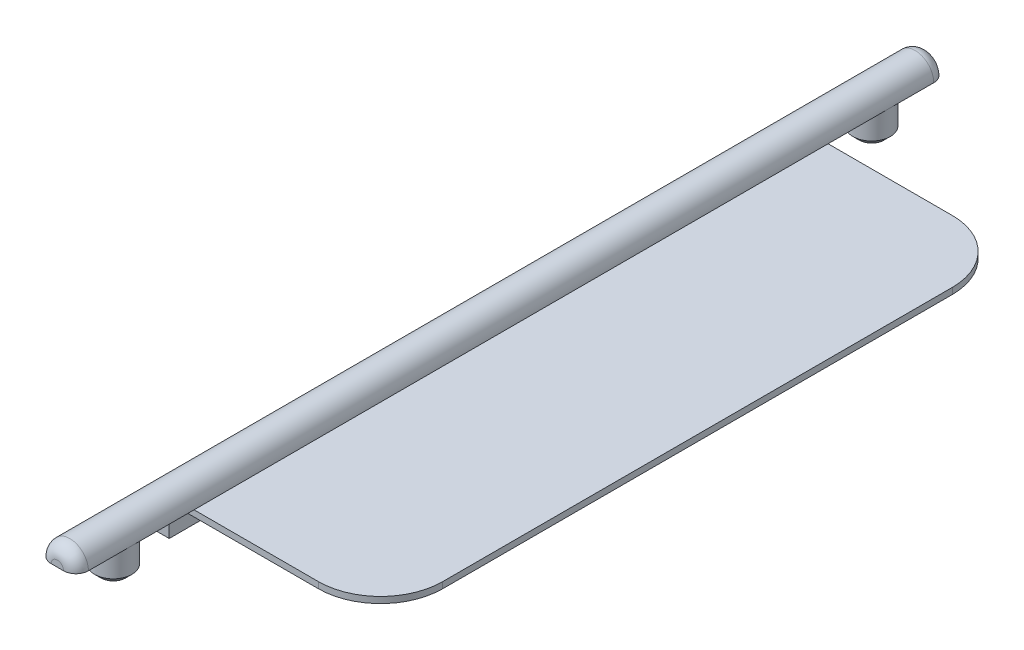
ISO-10303-21;
HEADER;
FILE_DESCRIPTION(('STEP AP214'),'2;1');
FILE_NAME('part.step','',(''),(''),'','','');
FILE_SCHEMA(('AUTOMOTIVE_DESIGN { 1 0 10303 214 1 1 1 1 }'));
ENDSEC;
DATA;
#1=APPLICATION_CONTEXT('core data for automotive mechanical design processes');
#2=APPLICATION_PROTOCOL_DEFINITION('international standard','automotive_design',2000,#1);
#3=PRODUCT_CONTEXT('',#1,'mechanical');
#4=PRODUCT('Part','Part','',(#3));
#5=PRODUCT_RELATED_PRODUCT_CATEGORY('part','',(#4));
#6=PRODUCT_DEFINITION_FORMATION('','',#4);
#7=PRODUCT_DEFINITION_CONTEXT('part definition',#1,'design');
#8=PRODUCT_DEFINITION('design','',#6,#7);
#9=PRODUCT_DEFINITION_SHAPE('','',#8);
#10=(LENGTH_UNIT() NAMED_UNIT(*) SI_UNIT(.MILLI.,.METRE.));
#11=(NAMED_UNIT(*) PLANE_ANGLE_UNIT() SI_UNIT($,.RADIAN.));
#12=(NAMED_UNIT(*) SI_UNIT($,.STERADIAN.) SOLID_ANGLE_UNIT());
#13=UNCERTAINTY_MEASURE_WITH_UNIT(LENGTH_MEASURE(1.E-05),#10,'distance_accuracy_value','');
#14=(GEOMETRIC_REPRESENTATION_CONTEXT(3) GLOBAL_UNCERTAINTY_ASSIGNED_CONTEXT((#13)) GLOBAL_UNIT_ASSIGNED_CONTEXT((#10,
#11,#12)) REPRESENTATION_CONTEXT('',''));
#15=CARTESIAN_POINT('',(0.,0.,0.));
#16=DIRECTION('',(0.,0.,1.));
#17=DIRECTION('',(1.,0.,0.));
#18=AXIS2_PLACEMENT_3D('',#15,#16,#17);
#19=CARTESIAN_POINT('',(-3.,0.,140.));
#20=DIRECTION('',(0.,1.,0.));
#21=DIRECTION('',(0.,0.,1.));
#22=AXIS2_PLACEMENT_3D('',#19,#20,#21);
#23=PLANE('',#22);
#24=DIRECTION('',(0.,0.,1.));
#25=VECTOR('',#24,1.);
#26=CARTESIAN_POINT('',(-1.,0.,19.));
#27=LINE('',#26,#25);
#28=CARTESIAN_POINT('',(-0.999999999999997,0.,19.));
#29=VERTEX_POINT('',#28);
#30=CARTESIAN_POINT('',(-1.,0.,121.));
#31=VERTEX_POINT('',#30);
#32=EDGE_CURVE('E50',#29,#31,#27,.T.);
#33=ORIENTED_EDGE('',*,*,#32,.F.);
#34=DIRECTION('',(-1.,0.,0.));
#35=VECTOR('',#34,1.);
#36=CARTESIAN_POINT('',(3.,0.,19.));
#37=LINE('',#36,#35);
#38=CARTESIAN_POINT('',(23.,0.,19.));
#39=VERTEX_POINT('',#38);
#40=EDGE_CURVE('E206',#39,#29,#37,.T.);
#41=ORIENTED_EDGE('',*,*,#40,.F.);
#42=CARTESIAN_POINT('',(23.,0.,29.));
#43=DIRECTION('',(0.,1.,0.));
#44=DIRECTION('',(0.,0.,1.));
#45=AXIS2_PLACEMENT_3D('',#42,#43,#44);
#46=CIRCLE('',#45,10.);
#47=CARTESIAN_POINT('',(33.,0.,29.));
#48=VERTEX_POINT('',#47);
#49=EDGE_CURVE('E42',#39,#48,#46,.F.);
#50=ORIENTED_EDGE('',*,*,#49,.T.);
#51=DIRECTION('',(0.,0.,-1.));
#52=VECTOR('',#51,1.);
#53=CARTESIAN_POINT('',(33.,0.,121.));
#54=LINE('',#53,#52);
#55=CARTESIAN_POINT('',(33.,0.,111.));
#56=VERTEX_POINT('',#55);
#57=EDGE_CURVE('E177',#56,#48,#54,.T.);
#58=ORIENTED_EDGE('',*,*,#57,.F.);
#59=CARTESIAN_POINT('',(23.,0.,111.));
#60=DIRECTION('',(0.,1.,0.));
#61=DIRECTION('',(0.,0.,1.));
#62=AXIS2_PLACEMENT_3D('',#59,#60,#61);
#63=CIRCLE('',#62,10.);
#64=CARTESIAN_POINT('',(23.,0.,121.));
#65=VERTEX_POINT('',#64);
#66=EDGE_CURVE('E222',#56,#65,#63,.F.);
#67=ORIENTED_EDGE('',*,*,#66,.T.);
#68=DIRECTION('',(1.,0.,0.));
#69=VECTOR('',#68,1.);
#70=CARTESIAN_POINT('',(-3.,0.,121.));
#71=LINE('',#70,#69);
#72=EDGE_CURVE('E56',#31,#65,#71,.T.);
#73=ORIENTED_EDGE('',*,*,#72,.F.);
#74=EDGE_LOOP('',(#33,#41,#50,#58,#67,#73));
#75=FACE_BOUND('',#74,.T.);
#76=ADVANCED_FACE('F33',(#75),#23,.F.);
#77=CARTESIAN_POINT('',(0.,1.,0.));
#78=DIRECTION('',(0.,-1.,0.));
#79=DIRECTION('',(0.,0.,-1.));
#80=AXIS2_PLACEMENT_3D('',#77,#78,#79);
#81=PLANE('',#80);
#82=DIRECTION('',(0.,0.,-1.));
#83=VECTOR('',#82,1.);
#84=CARTESIAN_POINT('',(-3.,1.,0.));
#85=LINE('',#84,#83);
#86=CARTESIAN_POINT('',(-3.,1.,19.));
#87=VERTEX_POINT('',#86);
#88=CARTESIAN_POINT('',(-3.,1.,9.00000000000001));
#89=VERTEX_POINT('',#88);
#90=EDGE_CURVE('E207',#87,#89,#85,.T.);
#91=ORIENTED_EDGE('',*,*,#90,.T.);
#92=CARTESIAN_POINT('',(0.,1.,9.00000000000001));
#93=DIRECTION('',(0.,-1.,0.));
#94=DIRECTION('',(0.,0.,-1.));
#95=AXIS2_PLACEMENT_3D('',#92,#93,#94);
#96=CIRCLE('',#95,3.);
#97=CARTESIAN_POINT('',(3.,1.,9.00000000000001));
#98=VERTEX_POINT('',#97);
#99=EDGE_CURVE('E201',#98,#89,#96,.T.);
#100=ORIENTED_EDGE('',*,*,#99,.F.);
#101=DIRECTION('',(0.,0.,1.));
#102=VECTOR('',#101,1.);
#103=CARTESIAN_POINT('',(3.,1.,0.));
#104=LINE('',#103,#102);
#105=CARTESIAN_POINT('',(3.,1.,19.));
#106=VERTEX_POINT('',#105);
#107=EDGE_CURVE('E214',#98,#106,#104,.T.);
#108=ORIENTED_EDGE('',*,*,#107,.T.);
#109=DIRECTION('',(-1.,0.,0.));
#110=VECTOR('',#109,1.);
#111=CARTESIAN_POINT('',(3.,1.,19.));
#112=LINE('',#111,#110);
#113=EDGE_CURVE('E153',#106,#87,#112,.T.);
#114=ORIENTED_EDGE('',*,*,#113,.T.);
#115=EDGE_LOOP('',(#91,#100,#108,#114));
#116=FACE_BOUND('',#115,.T.);
#117=ADVANCED_FACE('F319',(#116),#81,.T.);
#118=CARTESIAN_POINT('',(-3.,1.,2.));
#119=VERTEX_POINT('',#118);
#120=EDGE_CURVE('E211',#89,#119,#85,.T.);
#121=ORIENTED_EDGE('',*,*,#120,.T.);
#122=CARTESIAN_POINT('',(-1.,1.,2.));
#123=DIRECTION('',(0.,-1.,0.));
#124=DIRECTION('',(0.,0.,-1.));
#125=AXIS2_PLACEMENT_3D('',#122,#123,#124);
#126=CIRCLE('',#125,2.);
#127=CARTESIAN_POINT('',(-1.,1.,0.));
#128=VERTEX_POINT('',#127);
#129=EDGE_CURVE('E236',#119,#128,#126,.T.);
#130=ORIENTED_EDGE('',*,*,#129,.T.);
#131=DIRECTION('',(1.,0.,0.));
#132=VECTOR('',#131,1.);
#133=CARTESIAN_POINT('',(3.,1.,0.));
#134=LINE('',#133,#132);
#135=CARTESIAN_POINT('',(1.,1.,0.));
#136=VERTEX_POINT('',#135);
#137=EDGE_CURVE('E210',#128,#136,#134,.T.);
#138=ORIENTED_EDGE('',*,*,#137,.T.);
#139=CARTESIAN_POINT('',(1.,1.,2.));
#140=DIRECTION('',(0.,-1.,0.));
#141=DIRECTION('',(0.,0.,-1.));
#142=AXIS2_PLACEMENT_3D('',#139,#140,#141);
#143=CIRCLE('',#142,2.);
#144=CARTESIAN_POINT('',(3.,1.,2.));
#145=VERTEX_POINT('',#144);
#146=EDGE_CURVE('E238',#136,#145,#143,.T.);
#147=ORIENTED_EDGE('',*,*,#146,.T.);
#148=EDGE_CURVE('E215',#145,#98,#104,.T.);
#149=ORIENTED_EDGE('',*,*,#148,.T.);
#150=CARTESIAN_POINT('',(0.,1.,9.00000000000001));
#151=DIRECTION('',(0.,-1.,0.));
#152=DIRECTION('',(0.,0.,-1.));
#153=AXIS2_PLACEMENT_3D('',#150,#151,#152);
#154=CIRCLE('',#153,3.);
#155=EDGE_CURVE('E264',#98,#89,#154,.F.);
#156=ORIENTED_EDGE('',*,*,#155,.T.);
#157=EDGE_LOOP('',(#121,#130,#138,#147,#149,#156));
#158=FACE_BOUND('',#157,.T.);
#159=ADVANCED_FACE('F327',(#158),#81,.T.);
#160=CARTESIAN_POINT('',(0.,1.,0.));
#161=DIRECTION('',(0.,-1.,0.));
#162=DIRECTION('',(0.,0.,-1.));
#163=AXIS2_PLACEMENT_3D('',#160,#161,#162);
#164=PLANE('',#163);
#165=DIRECTION('',(-1.,0.,0.));
#166=VECTOR('',#165,1.);
#167=CARTESIAN_POINT('',(-3.,1.,140.));
#168=LINE('',#167,#166);
#169=CARTESIAN_POINT('',(0.999999999999999,1.,140.));
#170=VERTEX_POINT('',#169);
#171=CARTESIAN_POINT('',(-1.,1.,140.));
#172=VERTEX_POINT('',#171);
#173=EDGE_CURVE('E282',#170,#172,#168,.T.);
#174=ORIENTED_EDGE('',*,*,#173,.T.);
#175=CARTESIAN_POINT('',(-1.,1.,138.));
#176=DIRECTION('',(0.,-1.,0.));
#177=DIRECTION('',(0.,0.,-1.));
#178=AXIS2_PLACEMENT_3D('',#175,#176,#177);
#179=CIRCLE('',#178,2.);
#180=CARTESIAN_POINT('',(-3.,1.,138.));
#181=VERTEX_POINT('',#180);
#182=EDGE_CURVE('E245',#172,#181,#179,.T.);
#183=ORIENTED_EDGE('',*,*,#182,.T.);
#184=DIRECTION('',(0.,0.,-1.));
#185=VECTOR('',#184,1.);
#186=CARTESIAN_POINT('',(-3.,1.,140.));
#187=LINE('',#186,#185);
#188=CARTESIAN_POINT('',(-3.,1.,131.));
#189=VERTEX_POINT('',#188);
#190=EDGE_CURVE('E274',#181,#189,#187,.T.);
#191=ORIENTED_EDGE('',*,*,#190,.T.);
#192=CARTESIAN_POINT('',(0.,1.,131.));
#193=DIRECTION('',(0.,-1.,0.));
#194=DIRECTION('',(0.,0.,-1.));
#195=AXIS2_PLACEMENT_3D('',#192,#193,#194);
#196=CIRCLE('',#195,3.);
#197=CARTESIAN_POINT('',(3.,1.,131.));
#198=VERTEX_POINT('',#197);
#199=EDGE_CURVE('E203',#198,#189,#196,.T.);
#200=ORIENTED_EDGE('',*,*,#199,.F.);
#201=DIRECTION('',(0.,0.,-1.));
#202=VECTOR('',#201,1.);
#203=CARTESIAN_POINT('',(3.,1.,140.));
#204=LINE('',#203,#202);
#205=CARTESIAN_POINT('',(3.,1.,138.));
#206=VERTEX_POINT('',#205);
#207=EDGE_CURVE('E270',#206,#198,#204,.T.);
#208=ORIENTED_EDGE('',*,*,#207,.F.);
#209=CARTESIAN_POINT('',(1.,1.,138.));
#210=DIRECTION('',(0.,-1.,0.));
#211=DIRECTION('',(0.,0.,-1.));
#212=AXIS2_PLACEMENT_3D('',#209,#210,#211);
#213=CIRCLE('',#212,2.);
#214=EDGE_CURVE('E247',#206,#170,#213,.T.);
#215=ORIENTED_EDGE('',*,*,#214,.T.);
#216=EDGE_LOOP('',(#174,#183,#191,#200,#208,#215));
#217=FACE_BOUND('',#216,.T.);
#218=ADVANCED_FACE('F286',(#217),#164,.T.);
#219=CARTESIAN_POINT('',(3.,1.,121.));
#220=VERTEX_POINT('',#219);
#221=EDGE_CURVE('E272',#198,#220,#204,.T.);
#222=ORIENTED_EDGE('',*,*,#221,.F.);
#223=CARTESIAN_POINT('',(0.,1.,131.));
#224=DIRECTION('',(0.,-1.,0.));
#225=DIRECTION('',(0.,0.,-1.));
#226=AXIS2_PLACEMENT_3D('',#223,#224,#225);
#227=CIRCLE('',#226,3.);
#228=EDGE_CURVE('E267',#198,#189,#227,.F.);
#229=ORIENTED_EDGE('',*,*,#228,.T.);
#230=CARTESIAN_POINT('',(-3.,1.,121.));
#231=VERTEX_POINT('',#230);
#232=EDGE_CURVE('E276',#189,#231,#187,.T.);
#233=ORIENTED_EDGE('',*,*,#232,.T.);
#234=DIRECTION('',(1.,0.,0.));
#235=VECTOR('',#234,1.);
#236=CARTESIAN_POINT('',(-3.,1.,121.));
#237=LINE('',#236,#235);
#238=EDGE_CURVE('E278',#231,#220,#237,.T.);
#239=ORIENTED_EDGE('',*,*,#238,.T.);
#240=EDGE_LOOP('',(#222,#229,#233,#239));
#241=FACE_BOUND('',#240,.T.);
#242=ADVANCED_FACE('F305',(#241),#164,.T.);
#243=CARTESIAN_POINT('',(0.,1.,0.));
#244=DIRECTION('',(0.,0.,1.));
#245=DIRECTION('',(1.,0.,0.));
#246=AXIS2_PLACEMENT_3D('',#243,#244,#245);
#247=PLANE('',#246);
#248=ORIENTED_EDGE('',*,*,#137,.F.);
#249=CARTESIAN_POINT('',(0.,1.,0.));
#250=DIRECTION('',(0.,0.,1.));
#251=DIRECTION('',(1.,0.,0.));
#252=AXIS2_PLACEMENT_3D('',#249,#250,#251);
#253=CIRCLE('',#252,1.);
#254=EDGE_CURVE('E234',#128,#136,#253,.F.);
#255=ORIENTED_EDGE('',*,*,#254,.T.);
#256=EDGE_LOOP('',(#248,#255));
#257=FACE_BOUND('',#256,.T.);
#258=ADVANCED_FACE('F335',(#257),#247,.F.);
#259=CARTESIAN_POINT('',(0.,1.,140.));
#260=DIRECTION('',(0.,0.,1.));
#261=DIRECTION('',(1.,0.,0.));
#262=AXIS2_PLACEMENT_3D('',#259,#260,#261);
#263=PLANE('',#262);
#264=ORIENTED_EDGE('',*,*,#173,.F.);
#265=CARTESIAN_POINT('',(0.,1.,140.));
#266=DIRECTION('',(0.,0.,1.));
#267=DIRECTION('',(1.,0.,0.));
#268=AXIS2_PLACEMENT_3D('',#265,#266,#267);
#269=CIRCLE('',#268,1.);
#270=EDGE_CURVE('E249',#170,#172,#269,.T.);
#271=ORIENTED_EDGE('',*,*,#270,.T.);
#272=EDGE_LOOP('',(#264,#271));
#273=FACE_BOUND('',#272,.T.);
#274=ADVANCED_FACE('F292',(#273),#263,.T.);
#275=CARTESIAN_POINT('',(-3.,0.,140.));
#276=DIRECTION('',(1.,0.,0.));
#277=DIRECTION('',(0.,0.,-1.));
#278=AXIS2_PLACEMENT_3D('',#275,#276,#277);
#279=PLANE('',#278);
#280=EDGE_CURVE('E149',#231,#87,#187,.T.);
#281=ORIENTED_EDGE('',*,*,#280,.T.);
#282=DIRECTION('',(0.,-1.,0.));
#283=VECTOR('',#282,1.);
#284=CARTESIAN_POINT('',(-3.,1.,19.));
#285=LINE('',#284,#283);
#286=CARTESIAN_POINT('',(-3.,-5.,19.));
#287=VERTEX_POINT('',#286);
#288=EDGE_CURVE('E142',#87,#287,#285,.T.);
#289=ORIENTED_EDGE('',*,*,#288,.T.);
#290=DIRECTION('',(0.,0.,-1.));
#291=VECTOR('',#290,1.);
#292=CARTESIAN_POINT('',(-3.,-5.,19.));
#293=LINE('',#292,#291);
#294=CARTESIAN_POINT('',(-3.,-5.,121.));
#295=VERTEX_POINT('',#294);
#296=EDGE_CURVE('E147',#295,#287,#293,.T.);
#297=ORIENTED_EDGE('',*,*,#296,.F.);
#298=DIRECTION('',(0.,-1.,0.));
#299=VECTOR('',#298,1.);
#300=CARTESIAN_POINT('',(-3.,1.,121.));
#301=LINE('',#300,#299);
#302=EDGE_CURVE('E277',#231,#295,#301,.T.);
#303=ORIENTED_EDGE('',*,*,#302,.F.);
#304=EDGE_LOOP('',(#281,#289,#297,#303));
#305=FACE_BOUND('',#304,.T.);
#306=ADVANCED_FACE('F144',(#305),#279,.F.);
#307=CARTESIAN_POINT('',(0.,1.,140.));
#308=DIRECTION('',(0.,0.,-1.));
#309=DIRECTION('',(-1.,0.,0.));
#310=AXIS2_PLACEMENT_3D('',#307,#308,#309);
#311=CYLINDRICAL_SURFACE('',#310,3.);
#312=ORIENTED_EDGE('',*,*,#190,.F.);
#313=CARTESIAN_POINT('',(0.,1.,138.));
#314=DIRECTION('',(0.,0.,1.));
#315=DIRECTION('',(1.,0.,0.));
#316=AXIS2_PLACEMENT_3D('',#313,#314,#315);
#317=CIRCLE('',#316,3.);
#318=EDGE_CURVE('E240',#181,#206,#317,.F.);
#319=ORIENTED_EDGE('',*,*,#318,.T.);
#320=ORIENTED_EDGE('',*,*,#207,.T.);
#321=ORIENTED_EDGE('',*,*,#221,.T.);
#322=EDGE_CURVE('E273',#220,#106,#204,.T.);
#323=ORIENTED_EDGE('',*,*,#322,.T.);
#324=ORIENTED_EDGE('',*,*,#107,.F.);
#325=ORIENTED_EDGE('',*,*,#148,.F.);
#326=CARTESIAN_POINT('',(0.,1.,2.));
#327=DIRECTION('',(0.,0.,1.));
#328=DIRECTION('',(1.,0.,0.));
#329=AXIS2_PLACEMENT_3D('',#326,#327,#328);
#330=CIRCLE('',#329,3.);
#331=EDGE_CURVE('E242',#145,#119,#330,.T.);
#332=ORIENTED_EDGE('',*,*,#331,.T.);
#333=ORIENTED_EDGE('',*,*,#120,.F.);
#334=ORIENTED_EDGE('',*,*,#90,.F.);
#335=ORIENTED_EDGE('',*,*,#280,.F.);
#336=ORIENTED_EDGE('',*,*,#232,.F.);
#337=EDGE_LOOP('',(#312,#319,#320,#321,#323,#324,#325,#332,#333,#334,#335,#336));
#338=FACE_BOUND('',#337,.T.);
#339=ADVANCED_FACE('F297',(#338),#311,.T.);
#340=CARTESIAN_POINT('',(-3.,1.,121.));
#341=DIRECTION('',(0.,0.,-1.));
#342=DIRECTION('',(-1.,0.,0.));
#343=AXIS2_PLACEMENT_3D('',#340,#341,#342);
#344=PLANE('',#343);
#345=ORIENTED_EDGE('',*,*,#302,.T.);
#346=DIRECTION('',(-1.,0.,0.));
#347=VECTOR('',#346,1.);
#348=CARTESIAN_POINT('',(-3.,-5.,121.));
#349=LINE('',#348,#347);
#350=CARTESIAN_POINT('',(-1.,-5.,121.));
#351=VERTEX_POINT('',#350);
#352=EDGE_CURVE('E168',#351,#295,#349,.T.);
#353=ORIENTED_EDGE('',*,*,#352,.F.);
#354=DIRECTION('',(0.,1.,0.));
#355=VECTOR('',#354,1.);
#356=CARTESIAN_POINT('',(-1.,-5.,121.));
#357=LINE('',#356,#355);
#358=EDGE_CURVE('E174',#351,#31,#357,.T.);
#359=ORIENTED_EDGE('',*,*,#358,.T.);
#360=ORIENTED_EDGE('',*,*,#72,.T.);
#361=DIRECTION('',(0.,-1.,0.));
#362=VECTOR('',#361,1.);
#363=CARTESIAN_POINT('',(23.,1.,121.));
#364=LINE('',#363,#362);
#365=CARTESIAN_POINT('',(23.,1.,121.));
#366=VERTEX_POINT('',#365);
#367=EDGE_CURVE('E11',#65,#366,#364,.F.);
#368=ORIENTED_EDGE('',*,*,#367,.T.);
#369=DIRECTION('',(-1.,0.,0.));
#370=VECTOR('',#369,1.);
#371=CARTESIAN_POINT('',(33.,1.,121.));
#372=LINE('',#371,#370);
#373=EDGE_CURVE('E194',#366,#220,#372,.T.);
#374=ORIENTED_EDGE('',*,*,#373,.T.);
#375=ORIENTED_EDGE('',*,*,#238,.F.);
#376=EDGE_LOOP('',(#345,#353,#359,#360,#368,#374,#375));
#377=FACE_BOUND('',#376,.T.);
#378=ADVANCED_FACE('F379',(#377),#344,.F.);
#379=CARTESIAN_POINT('',(3.,1.,19.));
#380=DIRECTION('',(0.,0.,1.));
#381=DIRECTION('',(1.,0.,0.));
#382=AXIS2_PLACEMENT_3D('',#379,#380,#381);
#383=PLANE('',#382);
#384=DIRECTION('',(-1.,0.,0.));
#385=VECTOR('',#384,1.);
#386=CARTESIAN_POINT('',(33.,1.,19.));
#387=LINE('',#386,#385);
#388=CARTESIAN_POINT('',(23.,1.,19.));
#389=VERTEX_POINT('',#388);
#390=EDGE_CURVE('E197',#389,#106,#387,.T.);
#391=ORIENTED_EDGE('',*,*,#390,.F.);
#392=DIRECTION('',(0.,1.,0.));
#393=VECTOR('',#392,1.);
#394=CARTESIAN_POINT('',(23.,0.,19.));
#395=LINE('',#394,#393);
#396=EDGE_CURVE('E224',#389,#39,#395,.F.);
#397=ORIENTED_EDGE('',*,*,#396,.T.);
#398=ORIENTED_EDGE('',*,*,#40,.T.);
#399=DIRECTION('',(0.,1.,0.));
#400=VECTOR('',#399,1.);
#401=CARTESIAN_POINT('',(-1.,-5.,19.));
#402=LINE('',#401,#400);
#403=CARTESIAN_POINT('',(-1.,-5.,19.));
#404=VERTEX_POINT('',#403);
#405=EDGE_CURVE('E160',#404,#29,#402,.T.);
#406=ORIENTED_EDGE('',*,*,#405,.F.);
#407=DIRECTION('',(1.,0.,0.));
#408=VECTOR('',#407,1.);
#409=CARTESIAN_POINT('',(-3.,-5.,19.));
#410=LINE('',#409,#408);
#411=EDGE_CURVE('E156',#287,#404,#410,.T.);
#412=ORIENTED_EDGE('',*,*,#411,.F.);
#413=ORIENTED_EDGE('',*,*,#288,.F.);
#414=ORIENTED_EDGE('',*,*,#113,.F.);
#415=EDGE_LOOP('',(#391,#397,#398,#406,#412,#413,#414));
#416=FACE_BOUND('',#415,.T.);
#417=ADVANCED_FACE('F158',(#416),#383,.F.);
#418=CARTESIAN_POINT('',(0.,-4.,131.));
#419=DIRECTION('',(0.,1.,0.));
#420=DIRECTION('',(0.,0.,1.));
#421=AXIS2_PLACEMENT_3D('',#418,#419,#420);
#422=CYLINDRICAL_SURFACE('',#421,3.);
#423=CARTESIAN_POINT('',(0.,-3.,131.));
#424=DIRECTION('',(0.,-1.,0.));
#425=DIRECTION('',(0.,0.,-1.));
#426=AXIS2_PLACEMENT_3D('',#423,#424,#425);
#427=CIRCLE('',#426,3.);
#428=CARTESIAN_POINT('',(0.,-3.,128.));
#429=VERTEX_POINT('',#428);
#430=EDGE_CURVE('E258',#429,#429,#427,.F.);
#431=ORIENTED_EDGE('',*,*,#430,.T.);
#432=EDGE_LOOP('',(#431));
#433=FACE_BOUND('',#432,.T.);
#434=ORIENTED_EDGE('',*,*,#199,.T.);
#435=ORIENTED_EDGE('',*,*,#228,.F.);
#436=EDGE_LOOP('',(#434,#435));
#437=FACE_BOUND('',#436,.T.);
#438=ADVANCED_FACE('F399',(#433,#437),#422,.T.);
#439=CARTESIAN_POINT('',(0.,-4.,131.));
#440=DIRECTION('',(0.,-1.,0.));
#441=DIRECTION('',(0.,0.,-1.));
#442=AXIS2_PLACEMENT_3D('',#439,#440,#441);
#443=PLANE('',#442);
#444=CARTESIAN_POINT('',(0.,-4.,131.));
#445=DIRECTION('',(0.,-1.,0.));
#446=DIRECTION('',(0.,0.,-1.));
#447=AXIS2_PLACEMENT_3D('',#444,#445,#446);
#448=CIRCLE('',#447,2.);
#449=CARTESIAN_POINT('',(0.,-4.,129.));
#450=VERTEX_POINT('',#449);
#451=EDGE_CURVE('E261',#450,#450,#448,.T.);
#452=ORIENTED_EDGE('',*,*,#451,.T.);
#453=EDGE_LOOP('',(#452));
#454=FACE_BOUND('',#453,.T.);
#455=ADVANCED_FACE('F395',(#454),#443,.T.);
#456=CARTESIAN_POINT('',(0.,-4.,9.00000000000001));
#457=DIRECTION('',(0.,1.,0.));
#458=DIRECTION('',(0.,0.,1.));
#459=AXIS2_PLACEMENT_3D('',#456,#457,#458);
#460=CYLINDRICAL_SURFACE('',#459,3.);
#461=CARTESIAN_POINT('',(0.,-3.,9.00000000000001));
#462=DIRECTION('',(0.,-1.,0.));
#463=DIRECTION('',(0.,0.,-1.));
#464=AXIS2_PLACEMENT_3D('',#461,#462,#463);
#465=CIRCLE('',#464,3.);
#466=CARTESIAN_POINT('',(0.,-3.,6.00000000000001));
#467=VERTEX_POINT('',#466);
#468=EDGE_CURVE('E252',#467,#467,#465,.F.);
#469=ORIENTED_EDGE('',*,*,#468,.T.);
#470=EDGE_LOOP('',(#469));
#471=FACE_BOUND('',#470,.T.);
#472=ORIENTED_EDGE('',*,*,#99,.T.);
#473=ORIENTED_EDGE('',*,*,#155,.F.);
#474=EDGE_LOOP('',(#472,#473));
#475=FACE_BOUND('',#474,.T.);
#476=ADVANCED_FACE('F323',(#471,#475),#460,.T.);
#477=CARTESIAN_POINT('',(0.,-4.,9.00000000000001));
#478=DIRECTION('',(0.,-1.,0.));
#479=DIRECTION('',(0.,0.,-1.));
#480=AXIS2_PLACEMENT_3D('',#477,#478,#479);
#481=PLANE('',#480);
#482=CARTESIAN_POINT('',(0.,-4.,9.00000000000001));
#483=DIRECTION('',(0.,-1.,0.));
#484=DIRECTION('',(0.,0.,-1.));
#485=AXIS2_PLACEMENT_3D('',#482,#483,#484);
#486=CIRCLE('',#485,2.);
#487=CARTESIAN_POINT('',(0.,-4.,7.00000000000001));
#488=VERTEX_POINT('',#487);
#489=EDGE_CURVE('E255',#488,#488,#486,.T.);
#490=ORIENTED_EDGE('',*,*,#489,.T.);
#491=EDGE_LOOP('',(#490));
#492=FACE_BOUND('',#491,.T.);
#493=ADVANCED_FACE('F358',(#492),#481,.T.);
#494=CARTESIAN_POINT('',(0.,-4.,131.));
#495=DIRECTION('',(0.,1.,0.));
#496=DIRECTION('',(0.,0.,1.));
#497=AXIS2_PLACEMENT_3D('',#494,#495,#496);
#498=CONICAL_SURFACE('',#497,2.,0.785398163397447);
#499=ORIENTED_EDGE('',*,*,#430,.F.);
#500=EDGE_LOOP('',(#499));
#501=FACE_BOUND('',#500,.T.);
#502=ORIENTED_EDGE('',*,*,#451,.F.);
#503=EDGE_LOOP('',(#502));
#504=FACE_BOUND('',#503,.T.);
#505=ADVANCED_FACE('F354',(#501,#504),#498,.T.);
#506=CARTESIAN_POINT('',(0.,-4.,9.00000000000001));
#507=DIRECTION('',(0.,1.,0.));
#508=DIRECTION('',(0.,0.,1.));
#509=AXIS2_PLACEMENT_3D('',#506,#507,#508);
#510=CONICAL_SURFACE('',#509,2.,0.78539816339745);
#511=ORIENTED_EDGE('',*,*,#468,.F.);
#512=EDGE_LOOP('',(#511));
#513=FACE_BOUND('',#512,.T.);
#514=ORIENTED_EDGE('',*,*,#489,.F.);
#515=EDGE_LOOP('',(#514));
#516=FACE_BOUND('',#515,.T.);
#517=ADVANCED_FACE('F357',(#513,#516),#510,.T.);
#518=CARTESIAN_POINT('',(0.,1.,138.));
#519=DIRECTION('',(0.,0.,1.));
#520=DIRECTION('',(1.,0.,0.));
#521=AXIS2_PLACEMENT_3D('',#518,#519,#520);
#522=DEGENERATE_TOROIDAL_SURFACE('',#521,1.,2.,.T.);
#523=ORIENTED_EDGE('',*,*,#214,.F.);
#524=ORIENTED_EDGE('',*,*,#318,.F.);
#525=ORIENTED_EDGE('',*,*,#182,.F.);
#526=ORIENTED_EDGE('',*,*,#270,.F.);
#527=EDGE_LOOP('',(#523,#524,#525,#526));
#528=FACE_BOUND('',#527,.T.);
#529=ADVANCED_FACE('F294',(#528),#522,.T.);
#530=CARTESIAN_POINT('',(0.,1.,2.));
#531=DIRECTION('',(0.,0.,1.));
#532=DIRECTION('',(1.,0.,0.));
#533=AXIS2_PLACEMENT_3D('',#530,#531,#532);
#534=DEGENERATE_TOROIDAL_SURFACE('',#533,1.,2.,.T.);
#535=ORIENTED_EDGE('',*,*,#146,.F.);
#536=ORIENTED_EDGE('',*,*,#254,.F.);
#537=ORIENTED_EDGE('',*,*,#129,.F.);
#538=ORIENTED_EDGE('',*,*,#331,.F.);
#539=EDGE_LOOP('',(#535,#536,#537,#538));
#540=FACE_BOUND('',#539,.T.);
#541=ADVANCED_FACE('F331',(#540),#534,.T.);
#542=CARTESIAN_POINT('',(33.,1.,121.));
#543=DIRECTION('',(0.,-1.,0.));
#544=DIRECTION('',(0.,0.,-1.));
#545=AXIS2_PLACEMENT_3D('',#542,#543,#544);
#546=PLANE('',#545);
#547=DIRECTION('',(0.,0.,1.));
#548=VECTOR('',#547,1.);
#549=CARTESIAN_POINT('',(33.,1.,121.));
#550=LINE('',#549,#548);
#551=CARTESIAN_POINT('',(33.,1.,29.));
#552=VERTEX_POINT('',#551);
#553=CARTESIAN_POINT('',(33.,1.,111.));
#554=VERTEX_POINT('',#553);
#555=EDGE_CURVE('E187',#552,#554,#550,.T.);
#556=ORIENTED_EDGE('',*,*,#555,.F.);
#557=CARTESIAN_POINT('',(23.,1.,29.));
#558=DIRECTION('',(0.,-1.,0.));
#559=DIRECTION('',(0.,0.,-1.));
#560=AXIS2_PLACEMENT_3D('',#557,#558,#559);
#561=CIRCLE('',#560,10.);
#562=EDGE_CURVE('E226',#552,#389,#561,.F.);
#563=ORIENTED_EDGE('',*,*,#562,.T.);
#564=ORIENTED_EDGE('',*,*,#390,.T.);
#565=ORIENTED_EDGE('',*,*,#322,.F.);
#566=ORIENTED_EDGE('',*,*,#373,.F.);
#567=CARTESIAN_POINT('',(23.,1.,111.));
#568=DIRECTION('',(0.,-1.,0.));
#569=DIRECTION('',(0.,0.,-1.));
#570=AXIS2_PLACEMENT_3D('',#567,#568,#569);
#571=CIRCLE('',#570,10.);
#572=EDGE_CURVE('E228',#366,#554,#571,.F.);
#573=ORIENTED_EDGE('',*,*,#572,.T.);
#574=EDGE_LOOP('',(#556,#563,#564,#565,#566,#573));
#575=FACE_BOUND('',#574,.T.);
#576=ADVANCED_FACE('F314',(#575),#546,.F.);
#577=CARTESIAN_POINT('',(33.,0.,0.));
#578=DIRECTION('',(1.,0.,0.));
#579=DIRECTION('',(0.,0.,-1.));
#580=AXIS2_PLACEMENT_3D('',#577,#578,#579);
#581=PLANE('',#580);
#582=ORIENTED_EDGE('',*,*,#57,.T.);
#583=DIRECTION('',(0.,1.,0.));
#584=VECTOR('',#583,1.);
#585=CARTESIAN_POINT('',(33.,1.,29.));
#586=LINE('',#585,#584);
#587=EDGE_CURVE('E230',#48,#552,#586,.T.);
#588=ORIENTED_EDGE('',*,*,#587,.T.);
#589=ORIENTED_EDGE('',*,*,#555,.T.);
#590=DIRECTION('',(0.,-1.,0.));
#591=VECTOR('',#590,1.);
#592=CARTESIAN_POINT('',(33.,0.,111.));
#593=LINE('',#592,#591);
#594=EDGE_CURVE('E232',#554,#56,#593,.T.);
#595=ORIENTED_EDGE('',*,*,#594,.T.);
#596=EDGE_LOOP('',(#582,#588,#589,#595));
#597=FACE_BOUND('',#596,.T.);
#598=ADVANCED_FACE('F368',(#597),#581,.T.);
#599=CARTESIAN_POINT('',(23.,0.,29.));
#600=DIRECTION('',(0.,-1.,0.));
#601=DIRECTION('',(0.,0.,-1.));
#602=AXIS2_PLACEMENT_3D('',#599,#600,#601);
#603=CYLINDRICAL_SURFACE('',#602,10.);
#604=ORIENTED_EDGE('',*,*,#49,.F.);
#605=ORIENTED_EDGE('',*,*,#396,.F.);
#606=ORIENTED_EDGE('',*,*,#562,.F.);
#607=ORIENTED_EDGE('',*,*,#587,.F.);
#608=EDGE_LOOP('',(#604,#605,#606,#607));
#609=FACE_BOUND('',#608,.T.);
#610=ADVANCED_FACE('F366',(#609),#603,.T.);
#611=CARTESIAN_POINT('',(23.,0.,111.));
#612=DIRECTION('',(0.,1.,0.));
#613=DIRECTION('',(0.,0.,1.));
#614=AXIS2_PLACEMENT_3D('',#611,#612,#613);
#615=CYLINDRICAL_SURFACE('',#614,10.);
#616=ORIENTED_EDGE('',*,*,#572,.F.);
#617=ORIENTED_EDGE('',*,*,#367,.F.);
#618=ORIENTED_EDGE('',*,*,#66,.F.);
#619=ORIENTED_EDGE('',*,*,#594,.F.);
#620=EDGE_LOOP('',(#616,#617,#618,#619));
#621=FACE_BOUND('',#620,.T.);
#622=ADVANCED_FACE('F35',(#621),#615,.T.);
#623=CARTESIAN_POINT('',(-1.,-5.,19.));
#624=DIRECTION('',(-1.,0.,0.));
#625=DIRECTION('',(0.,0.,1.));
#626=AXIS2_PLACEMENT_3D('',#623,#624,#625);
#627=PLANE('',#626);
#628=ORIENTED_EDGE('',*,*,#32,.T.);
#629=ORIENTED_EDGE('',*,*,#358,.F.);
#630=DIRECTION('',(0.,0.,1.));
#631=VECTOR('',#630,1.);
#632=CARTESIAN_POINT('',(-1.,-5.,19.));
#633=LINE('',#632,#631);
#634=EDGE_CURVE('E163',#404,#351,#633,.T.);
#635=ORIENTED_EDGE('',*,*,#634,.F.);
#636=ORIENTED_EDGE('',*,*,#405,.T.);
#637=EDGE_LOOP('',(#628,#629,#635,#636));
#638=FACE_BOUND('',#637,.T.);
#639=ADVANCED_FACE('F374',(#638),#627,.F.);
#640=CARTESIAN_POINT('',(0.,-5.,0.));
#641=DIRECTION('',(0.,1.,0.));
#642=DIRECTION('',(0.,0.,1.));
#643=AXIS2_PLACEMENT_3D('',#640,#641,#642);
#644=PLANE('',#643);
#645=ORIENTED_EDGE('',*,*,#296,.T.);
#646=ORIENTED_EDGE('',*,*,#411,.T.);
#647=ORIENTED_EDGE('',*,*,#634,.T.);
#648=ORIENTED_EDGE('',*,*,#352,.T.);
#649=EDGE_LOOP('',(#645,#646,#647,#648));
#650=FACE_BOUND('',#649,.T.);
#651=ADVANCED_FACE('F166',(#650),#644,.F.);
#652=CLOSED_SHELL('',(#76,#117,#159,#218,#242,#258,#274,#306,#339,#378,#417,#438,#455,#476,#493,
#505,#517,#529,#541,#576,#598,#610,#622,#639,#651));
#653=MANIFOLD_SOLID_BREP('B2',#652);
#654=ADVANCED_BREP_SHAPE_REPRESENTATION('',(#18,#653),#14);
#655=SHAPE_DEFINITION_REPRESENTATION(#9,#654);
ENDSEC;
END-ISO-10303-21;
